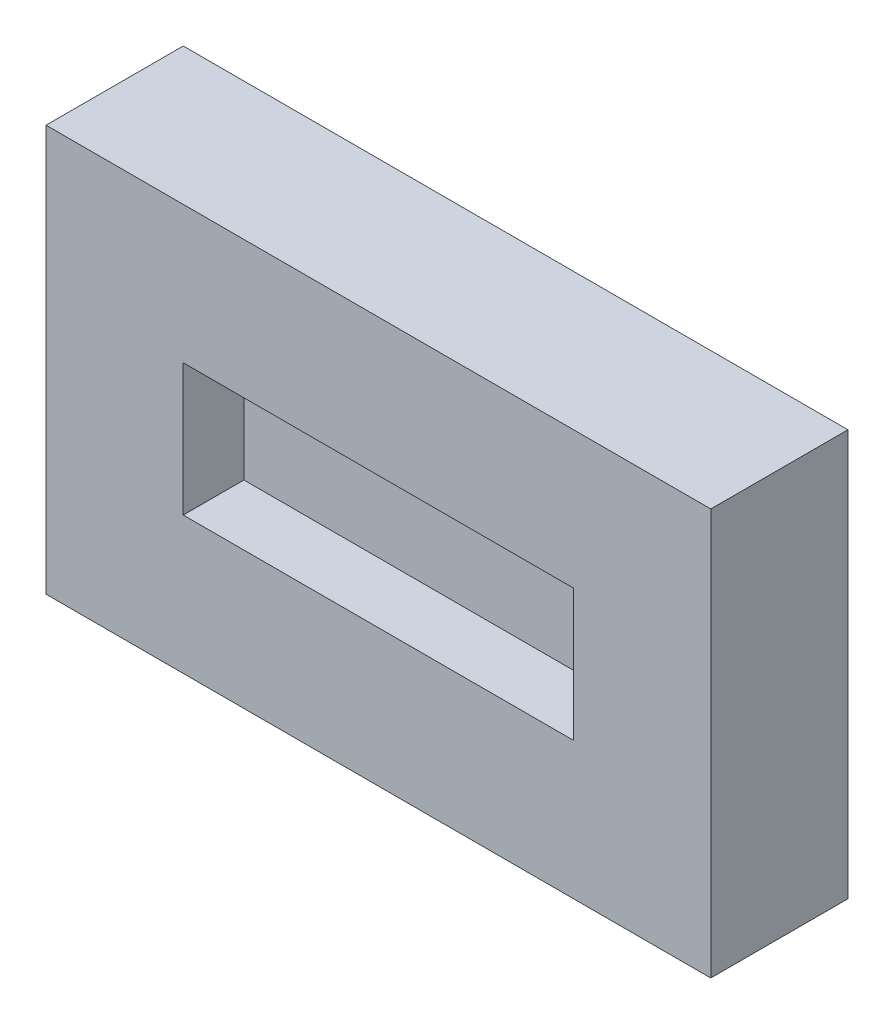
ISO-10303-21;
HEADER;
FILE_DESCRIPTION(('STEP AP214'),'2;1');
FILE_NAME('part.step','',(''),(''),'','','');
FILE_SCHEMA(('AUTOMOTIVE_DESIGN { 1 0 10303 214 1 1 1 1 }'));
ENDSEC;
DATA;
#1=APPLICATION_CONTEXT('core data for automotive mechanical design processes');
#2=APPLICATION_PROTOCOL_DEFINITION('international standard','automotive_design',2000,#1);
#3=PRODUCT_CONTEXT('',#1,'mechanical');
#4=PRODUCT('Part','Part','',(#3));
#5=PRODUCT_RELATED_PRODUCT_CATEGORY('part','',(#4));
#6=PRODUCT_DEFINITION_FORMATION('','',#4);
#7=PRODUCT_DEFINITION_CONTEXT('part definition',#1,'design');
#8=PRODUCT_DEFINITION('design','',#6,#7);
#9=PRODUCT_DEFINITION_SHAPE('','',#8);
#10=(LENGTH_UNIT() NAMED_UNIT(*) SI_UNIT(.MILLI.,.METRE.));
#11=(NAMED_UNIT(*) PLANE_ANGLE_UNIT() SI_UNIT($,.RADIAN.));
#12=(NAMED_UNIT(*) SI_UNIT($,.STERADIAN.) SOLID_ANGLE_UNIT());
#13=UNCERTAINTY_MEASURE_WITH_UNIT(LENGTH_MEASURE(1.E-05),#10,'distance_accuracy_value','');
#14=(GEOMETRIC_REPRESENTATION_CONTEXT(3) GLOBAL_UNCERTAINTY_ASSIGNED_CONTEXT((#13)) GLOBAL_UNIT_ASSIGNED_CONTEXT((#10,
#11,#12)) REPRESENTATION_CONTEXT('',''));
#15=CARTESIAN_POINT('',(0.,0.,0.));
#16=DIRECTION('',(0.,0.,1.));
#17=DIRECTION('',(1.,0.,0.));
#18=AXIS2_PLACEMENT_3D('',#15,#16,#17);
#19=CARTESIAN_POINT('',(315.,192.5,-65.));
#20=DIRECTION('',(0.,1.,0.));
#21=DIRECTION('',(-1.,0.,0.));
#22=AXIS2_PLACEMENT_3D('',#19,#20,#21);
#23=PLANE('',#22);
#24=DIRECTION('',(0.,0.,1.));
#25=VECTOR('',#24,1.);
#26=CARTESIAN_POINT('',(-315.,192.5,-65.));
#27=LINE('',#26,#25);
#28=CARTESIAN_POINT('',(-315.,192.5,-65.));
#29=VERTEX_POINT('',#28);
#30=CARTESIAN_POINT('',(-315.,192.5,65.));
#31=VERTEX_POINT('',#30);
#32=EDGE_CURVE('E64',#29,#31,#27,.T.);
#33=ORIENTED_EDGE('',*,*,#32,.T.);
#34=DIRECTION('',(-1.,0.,0.));
#35=VECTOR('',#34,1.);
#36=CARTESIAN_POINT('',(315.,192.5,65.));
#37=LINE('',#36,#35);
#38=CARTESIAN_POINT('',(315.,192.5,65.));
#39=VERTEX_POINT('',#38);
#40=EDGE_CURVE('E162',#39,#31,#37,.T.);
#41=ORIENTED_EDGE('',*,*,#40,.F.);
#42=DIRECTION('',(0.,0.,1.));
#43=VECTOR('',#42,1.);
#44=CARTESIAN_POINT('',(315.,192.5,-65.));
#45=LINE('',#44,#43);
#46=CARTESIAN_POINT('',(315.,192.5,-65.));
#47=VERTEX_POINT('',#46);
#48=EDGE_CURVE('E12',#47,#39,#45,.T.);
#49=ORIENTED_EDGE('',*,*,#48,.F.);
#50=DIRECTION('',(-1.,0.,0.));
#51=VECTOR('',#50,1.);
#52=CARTESIAN_POINT('',(315.,192.5,-65.));
#53=LINE('',#52,#51);
#54=EDGE_CURVE('E190',#47,#29,#53,.T.);
#55=ORIENTED_EDGE('',*,*,#54,.T.);
#56=EDGE_LOOP('',(#33,#41,#49,#55));
#57=FACE_BOUND('',#56,.T.);
#58=ADVANCED_FACE('F61',(#57),#23,.T.);
#59=CARTESIAN_POINT('',(315.,-192.5,-65.));
#60=DIRECTION('',(1.,0.,0.));
#61=DIRECTION('',(0.,0.,-1.));
#62=AXIS2_PLACEMENT_3D('',#59,#60,#61);
#63=PLANE('',#62);
#64=ORIENTED_EDGE('',*,*,#48,.T.);
#65=DIRECTION('',(0.,1.,0.));
#66=VECTOR('',#65,1.);
#67=CARTESIAN_POINT('',(315.,-192.5,65.));
#68=LINE('',#67,#66);
#69=CARTESIAN_POINT('',(315.,-192.5,65.));
#70=VERTEX_POINT('',#69);
#71=EDGE_CURVE('E174',#70,#39,#68,.T.);
#72=ORIENTED_EDGE('',*,*,#71,.F.);
#73=DIRECTION('',(0.,0.,1.));
#74=VECTOR('',#73,1.);
#75=CARTESIAN_POINT('',(315.,-192.5,-65.));
#76=LINE('',#75,#74);
#77=CARTESIAN_POINT('',(315.,-192.5,-65.));
#78=VERTEX_POINT('',#77);
#79=EDGE_CURVE('E70',#78,#70,#76,.T.);
#80=ORIENTED_EDGE('',*,*,#79,.F.);
#81=DIRECTION('',(0.,1.,0.));
#82=VECTOR('',#81,1.);
#83=CARTESIAN_POINT('',(315.,-192.5,-65.));
#84=LINE('',#83,#82);
#85=EDGE_CURVE('E206',#78,#47,#84,.T.);
#86=ORIENTED_EDGE('',*,*,#85,.T.);
#87=EDGE_LOOP('',(#64,#72,#80,#86));
#88=FACE_BOUND('',#87,.T.);
#89=ADVANCED_FACE('F222',(#88),#63,.T.);
#90=CARTESIAN_POINT('',(-315.,-192.5,-65.));
#91=DIRECTION('',(0.,-1.,0.));
#92=DIRECTION('',(1.,0.,0.));
#93=AXIS2_PLACEMENT_3D('',#90,#91,#92);
#94=PLANE('',#93);
#95=ORIENTED_EDGE('',*,*,#79,.T.);
#96=DIRECTION('',(1.,0.,0.));
#97=VECTOR('',#96,1.);
#98=CARTESIAN_POINT('',(-315.,-192.5,65.));
#99=LINE('',#98,#97);
#100=CARTESIAN_POINT('',(-315.,-192.5,65.));
#101=VERTEX_POINT('',#100);
#102=EDGE_CURVE('E170',#101,#70,#99,.T.);
#103=ORIENTED_EDGE('',*,*,#102,.F.);
#104=DIRECTION('',(0.,0.,1.));
#105=VECTOR('',#104,1.);
#106=CARTESIAN_POINT('',(-315.,-192.5,-65.));
#107=LINE('',#106,#105);
#108=CARTESIAN_POINT('',(-315.,-192.5,-65.));
#109=VERTEX_POINT('',#108);
#110=EDGE_CURVE('E211',#109,#101,#107,.T.);
#111=ORIENTED_EDGE('',*,*,#110,.F.);
#112=DIRECTION('',(1.,0.,0.));
#113=VECTOR('',#112,1.);
#114=CARTESIAN_POINT('',(-315.,-192.5,-65.));
#115=LINE('',#114,#113);
#116=EDGE_CURVE('E202',#109,#78,#115,.T.);
#117=ORIENTED_EDGE('',*,*,#116,.T.);
#118=EDGE_LOOP('',(#95,#103,#111,#117));
#119=FACE_BOUND('',#118,.T.);
#120=ADVANCED_FACE('F228',(#119),#94,.T.);
#121=CARTESIAN_POINT('',(-315.,192.5,-65.));
#122=DIRECTION('',(-1.,0.,0.));
#123=DIRECTION('',(0.,-1.,0.));
#124=AXIS2_PLACEMENT_3D('',#121,#122,#123);
#125=PLANE('',#124);
#126=ORIENTED_EDGE('',*,*,#110,.T.);
#127=DIRECTION('',(0.,-1.,0.));
#128=VECTOR('',#127,1.);
#129=CARTESIAN_POINT('',(-315.,192.5,65.));
#130=LINE('',#129,#128);
#131=EDGE_CURVE('E166',#31,#101,#130,.T.);
#132=ORIENTED_EDGE('',*,*,#131,.F.);
#133=ORIENTED_EDGE('',*,*,#32,.F.);
#134=DIRECTION('',(0.,-1.,0.));
#135=VECTOR('',#134,1.);
#136=CARTESIAN_POINT('',(-315.,192.5,-65.));
#137=LINE('',#136,#135);
#138=EDGE_CURVE('E198',#29,#109,#137,.T.);
#139=ORIENTED_EDGE('',*,*,#138,.T.);
#140=EDGE_LOOP('',(#126,#132,#133,#139));
#141=FACE_BOUND('',#140,.T.);
#142=ADVANCED_FACE('F217',(#141),#125,.T.);
#143=CARTESIAN_POINT('',(0.,0.,-65.));
#144=DIRECTION('',(0.,0.,1.));
#145=DIRECTION('',(1.,0.,0.));
#146=AXIS2_PLACEMENT_3D('',#143,#144,#145);
#147=PLANE('',#146);
#148=DIRECTION('',(0.,1.,0.));
#149=VECTOR('',#148,1.);
#150=CARTESIAN_POINT('',(185.,-62.4999999999999,-65.));
#151=LINE('',#150,#149);
#152=CARTESIAN_POINT('',(185.,-62.4999999999999,-65.));
#153=VERTEX_POINT('',#152);
#154=CARTESIAN_POINT('',(185.,62.5,-65.));
#155=VERTEX_POINT('',#154);
#156=EDGE_CURVE('E140',#153,#155,#151,.T.);
#157=ORIENTED_EDGE('',*,*,#156,.T.);
#158=DIRECTION('',(-1.,0.,0.));
#159=VECTOR('',#158,1.);
#160=CARTESIAN_POINT('',(185.,62.5,-65.));
#161=LINE('',#160,#159);
#162=CARTESIAN_POINT('',(-185.,62.5,-65.));
#163=VERTEX_POINT('',#162);
#164=EDGE_CURVE('E178',#155,#163,#161,.T.);
#165=ORIENTED_EDGE('',*,*,#164,.T.);
#166=DIRECTION('',(0.,-1.,0.));
#167=VECTOR('',#166,1.);
#168=CARTESIAN_POINT('',(-185.,62.5,-65.));
#169=LINE('',#168,#167);
#170=CARTESIAN_POINT('',(-185.,-62.5,-65.));
#171=VERTEX_POINT('',#170);
#172=EDGE_CURVE('E134',#163,#171,#169,.T.);
#173=ORIENTED_EDGE('',*,*,#172,.T.);
#174=DIRECTION('',(1.,0.,0.));
#175=VECTOR('',#174,1.);
#176=CARTESIAN_POINT('',(-185.,-62.5,-65.));
#177=LINE('',#176,#175);
#178=EDGE_CURVE('E78',#171,#153,#177,.T.);
#179=ORIENTED_EDGE('',*,*,#178,.T.);
#180=EDGE_LOOP('',(#157,#165,#173,#179));
#181=FACE_BOUND('',#180,.T.);
#182=ORIENTED_EDGE('',*,*,#54,.F.);
#183=ORIENTED_EDGE('',*,*,#85,.F.);
#184=ORIENTED_EDGE('',*,*,#116,.F.);
#185=ORIENTED_EDGE('',*,*,#138,.F.);
#186=EDGE_LOOP('',(#182,#183,#184,#185));
#187=FACE_BOUND('',#186,.T.);
#188=ADVANCED_FACE('F226',(#181,#187),#147,.F.);
#189=CARTESIAN_POINT('',(185.,62.5,-65.));
#190=DIRECTION('',(0.,1.,0.));
#191=DIRECTION('',(-1.,0.,0.));
#192=AXIS2_PLACEMENT_3D('',#189,#190,#191);
#193=PLANE('',#192);
#194=DIRECTION('',(0.,0.,1.));
#195=VECTOR('',#194,1.);
#196=CARTESIAN_POINT('',(185.,62.5,-65.));
#197=LINE('',#196,#195);
#198=CARTESIAN_POINT('',(185.,62.5,65.));
#199=VERTEX_POINT('',#198);
#200=EDGE_CURVE('E145',#155,#199,#197,.T.);
#201=ORIENTED_EDGE('',*,*,#200,.T.);
#202=DIRECTION('',(-1.,0.,0.));
#203=VECTOR('',#202,1.);
#204=CARTESIAN_POINT('',(185.,62.5,65.));
#205=LINE('',#204,#203);
#206=CARTESIAN_POINT('',(-185.,62.5,65.));
#207=VERTEX_POINT('',#206);
#208=EDGE_CURVE('E143',#199,#207,#205,.T.);
#209=ORIENTED_EDGE('',*,*,#208,.T.);
#210=DIRECTION('',(0.,0.,1.));
#211=VECTOR('',#210,1.);
#212=CARTESIAN_POINT('',(-185.,62.5,-65.));
#213=LINE('',#212,#211);
#214=EDGE_CURVE('E127',#163,#207,#213,.T.);
#215=ORIENTED_EDGE('',*,*,#214,.F.);
#216=ORIENTED_EDGE('',*,*,#164,.F.);
#217=EDGE_LOOP('',(#201,#209,#215,#216));
#218=FACE_BOUND('',#217,.T.);
#219=ADVANCED_FACE('F144',(#218),#193,.F.);
#220=CARTESIAN_POINT('',(185.,-62.4999999999999,-65.));
#221=DIRECTION('',(1.,0.,0.));
#222=DIRECTION('',(0.,0.,-1.));
#223=AXIS2_PLACEMENT_3D('',#220,#221,#222);
#224=PLANE('',#223);
#225=DIRECTION('',(0.,0.,1.));
#226=VECTOR('',#225,1.);
#227=CARTESIAN_POINT('',(185.,-62.4999999999999,-65.));
#228=LINE('',#227,#226);
#229=CARTESIAN_POINT('',(185.,-62.4999999999999,65.));
#230=VERTEX_POINT('',#229);
#231=EDGE_CURVE('E191',#153,#230,#228,.T.);
#232=ORIENTED_EDGE('',*,*,#231,.T.);
#233=DIRECTION('',(0.,1.,0.));
#234=VECTOR('',#233,1.);
#235=CARTESIAN_POINT('',(185.,-62.4999999999999,65.));
#236=LINE('',#235,#234);
#237=EDGE_CURVE('E157',#230,#199,#236,.T.);
#238=ORIENTED_EDGE('',*,*,#237,.T.);
#239=ORIENTED_EDGE('',*,*,#200,.F.);
#240=ORIENTED_EDGE('',*,*,#156,.F.);
#241=EDGE_LOOP('',(#232,#238,#239,#240));
#242=FACE_BOUND('',#241,.T.);
#243=ADVANCED_FACE('F271',(#242),#224,.F.);
#244=CARTESIAN_POINT('',(-185.,-62.5,-65.));
#245=DIRECTION('',(0.,-1.,0.));
#246=DIRECTION('',(1.,0.,0.));
#247=AXIS2_PLACEMENT_3D('',#244,#245,#246);
#248=PLANE('',#247);
#249=DIRECTION('',(0.,0.,1.));
#250=VECTOR('',#249,1.);
#251=CARTESIAN_POINT('',(-185.,-62.5,-65.));
#252=LINE('',#251,#250);
#253=CARTESIAN_POINT('',(-185.,-62.5,65.));
#254=VERTEX_POINT('',#253);
#255=EDGE_CURVE('E139',#171,#254,#252,.T.);
#256=ORIENTED_EDGE('',*,*,#255,.T.);
#257=DIRECTION('',(1.,0.,0.));
#258=VECTOR('',#257,1.);
#259=CARTESIAN_POINT('',(-185.,-62.5,65.));
#260=LINE('',#259,#258);
#261=EDGE_CURVE('E153',#254,#230,#260,.T.);
#262=ORIENTED_EDGE('',*,*,#261,.T.);
#263=ORIENTED_EDGE('',*,*,#231,.F.);
#264=ORIENTED_EDGE('',*,*,#178,.F.);
#265=EDGE_LOOP('',(#256,#262,#263,#264));
#266=FACE_BOUND('',#265,.T.);
#267=ADVANCED_FACE('F280',(#266),#248,.F.);
#268=CARTESIAN_POINT('',(-185.,62.5,-65.));
#269=DIRECTION('',(-1.,0.,0.));
#270=DIRECTION('',(0.,-1.,0.));
#271=AXIS2_PLACEMENT_3D('',#268,#269,#270);
#272=PLANE('',#271);
#273=ORIENTED_EDGE('',*,*,#214,.T.);
#274=DIRECTION('',(0.,-1.,0.));
#275=VECTOR('',#274,1.);
#276=CARTESIAN_POINT('',(-185.,62.5,65.));
#277=LINE('',#276,#275);
#278=EDGE_CURVE('E131',#207,#254,#277,.T.);
#279=ORIENTED_EDGE('',*,*,#278,.T.);
#280=ORIENTED_EDGE('',*,*,#255,.F.);
#281=ORIENTED_EDGE('',*,*,#172,.F.);
#282=EDGE_LOOP('',(#273,#279,#280,#281));
#283=FACE_BOUND('',#282,.T.);
#284=ADVANCED_FACE('F129',(#283),#272,.F.);
#285=CARTESIAN_POINT('',(0.,0.,65.));
#286=DIRECTION('',(0.,0.,1.));
#287=DIRECTION('',(1.,0.,0.));
#288=AXIS2_PLACEMENT_3D('',#285,#286,#287);
#289=PLANE('',#288);
#290=ORIENTED_EDGE('',*,*,#40,.T.);
#291=ORIENTED_EDGE('',*,*,#131,.T.);
#292=ORIENTED_EDGE('',*,*,#102,.T.);
#293=ORIENTED_EDGE('',*,*,#71,.T.);
#294=EDGE_LOOP('',(#290,#291,#292,#293));
#295=FACE_BOUND('',#294,.T.);
#296=ORIENTED_EDGE('',*,*,#278,.F.);
#297=ORIENTED_EDGE('',*,*,#208,.F.);
#298=ORIENTED_EDGE('',*,*,#237,.F.);
#299=ORIENTED_EDGE('',*,*,#261,.F.);
#300=EDGE_LOOP('',(#296,#297,#298,#299));
#301=FACE_BOUND('',#300,.T.);
#302=ADVANCED_FACE('F151',(#295,#301),#289,.T.);
#303=CLOSED_SHELL('',(#58,#89,#120,#142,#188,#219,#243,#267,#284,#302));
#304=MANIFOLD_SOLID_BREP('B2',#303);
#305=CARTESIAN_POINT('',(-185.,62.5,-7.5));
#306=DIRECTION('',(-1.,0.,0.));
#307=DIRECTION('',(0.,-1.,0.));
#308=AXIS2_PLACEMENT_3D('',#305,#306,#307);
#309=PLANE('',#308);
#310=DIRECTION('',(0.,0.,1.));
#311=VECTOR('',#310,1.);
#312=CARTESIAN_POINT('',(-185.,-62.5,-7.5));
#313=LINE('',#312,#311);
#314=CARTESIAN_POINT('',(-185.,-62.5,-7.5));
#315=VERTEX_POINT('',#314);
#316=CARTESIAN_POINT('',(-185.,-62.5,7.5));
#317=VERTEX_POINT('',#316);
#318=EDGE_CURVE('E358',#315,#317,#313,.T.);
#319=ORIENTED_EDGE('',*,*,#318,.T.);
#320=DIRECTION('',(0.,-1.,0.));
#321=VECTOR('',#320,1.);
#322=CARTESIAN_POINT('',(-185.,62.5,7.5));
#323=LINE('',#322,#321);
#324=CARTESIAN_POINT('',(-185.,62.5,7.5));
#325=VERTEX_POINT('',#324);
#326=EDGE_CURVE('E395',#325,#317,#323,.T.);
#327=ORIENTED_EDGE('',*,*,#326,.F.);
#328=DIRECTION('',(0.,0.,1.));
#329=VECTOR('',#328,1.);
#330=CARTESIAN_POINT('',(-185.,62.5,-7.5));
#331=LINE('',#330,#329);
#332=CARTESIAN_POINT('',(-185.,62.5,-7.5));
#333=VERTEX_POINT('',#332);
#334=EDGE_CURVE('E59',#333,#325,#331,.T.);
#335=ORIENTED_EDGE('',*,*,#334,.F.);
#336=DIRECTION('',(0.,-1.,0.));
#337=VECTOR('',#336,1.);
#338=CARTESIAN_POINT('',(-185.,62.5,-7.5));
#339=LINE('',#338,#337);
#340=EDGE_CURVE('E396',#333,#315,#339,.T.);
#341=ORIENTED_EDGE('',*,*,#340,.T.);
#342=EDGE_LOOP('',(#319,#327,#335,#341));
#343=FACE_BOUND('',#342,.T.);
#344=ADVANCED_FACE('F355',(#343),#309,.T.);
#345=CARTESIAN_POINT('',(185.,62.5,-7.5));
#346=DIRECTION('',(0.,1.,0.));
#347=DIRECTION('',(-1.,0.,0.));
#348=AXIS2_PLACEMENT_3D('',#345,#346,#347);
#349=PLANE('',#348);
#350=ORIENTED_EDGE('',*,*,#334,.T.);
#351=DIRECTION('',(-1.,0.,0.));
#352=VECTOR('',#351,1.);
#353=CARTESIAN_POINT('',(185.,62.5,7.5));
#354=LINE('',#353,#352);
#355=CARTESIAN_POINT('',(185.,62.5,7.5));
#356=VERTEX_POINT('',#355);
#357=EDGE_CURVE('E412',#356,#325,#354,.T.);
#358=ORIENTED_EDGE('',*,*,#357,.F.);
#359=DIRECTION('',(0.,0.,1.));
#360=VECTOR('',#359,1.);
#361=CARTESIAN_POINT('',(185.,62.5,-7.5));
#362=LINE('',#361,#360);
#363=CARTESIAN_POINT('',(185.,62.5,-7.5));
#364=VERTEX_POINT('',#363);
#365=EDGE_CURVE('E363',#364,#356,#362,.T.);
#366=ORIENTED_EDGE('',*,*,#365,.F.);
#367=DIRECTION('',(-1.,0.,0.));
#368=VECTOR('',#367,1.);
#369=CARTESIAN_POINT('',(185.,62.5,-7.5));
#370=LINE('',#369,#368);
#371=EDGE_CURVE('E401',#364,#333,#370,.T.);
#372=ORIENTED_EDGE('',*,*,#371,.T.);
#373=EDGE_LOOP('',(#350,#358,#366,#372));
#374=FACE_BOUND('',#373,.T.);
#375=ADVANCED_FACE('F427',(#374),#349,.T.);
#376=CARTESIAN_POINT('',(185.,62.5,-7.5));
#377=DIRECTION('',(1.,0.,0.));
#378=DIRECTION('',(0.,0.,-1.));
#379=AXIS2_PLACEMENT_3D('',#376,#377,#378);
#380=PLANE('',#379);
#381=ORIENTED_EDGE('',*,*,#365,.T.);
#382=DIRECTION('',(0.,1.,0.));
#383=VECTOR('',#382,1.);
#384=CARTESIAN_POINT('',(185.,62.5,7.5));
#385=LINE('',#384,#383);
#386=CARTESIAN_POINT('',(185.,-62.4999999999999,7.5));
#387=VERTEX_POINT('',#386);
#388=EDGE_CURVE('E408',#387,#356,#385,.T.);
#389=ORIENTED_EDGE('',*,*,#388,.F.);
#390=DIRECTION('',(0.,0.,1.));
#391=VECTOR('',#390,1.);
#392=CARTESIAN_POINT('',(185.,-62.4999999999999,-7.5));
#393=LINE('',#392,#391);
#394=CARTESIAN_POINT('',(185.,-62.4999999999999,-7.5));
#395=VERTEX_POINT('',#394);
#396=EDGE_CURVE('E400',#395,#387,#393,.T.);
#397=ORIENTED_EDGE('',*,*,#396,.F.);
#398=DIRECTION('',(0.,1.,0.));
#399=VECTOR('',#398,1.);
#400=CARTESIAN_POINT('',(185.,62.5,-7.5));
#401=LINE('',#400,#399);
#402=EDGE_CURVE('E420',#395,#364,#401,.T.);
#403=ORIENTED_EDGE('',*,*,#402,.T.);
#404=EDGE_LOOP('',(#381,#389,#397,#403));
#405=FACE_BOUND('',#404,.T.);
#406=ADVANCED_FACE('F424',(#405),#380,.T.);
#407=CARTESIAN_POINT('',(185.,-62.4999999999999,-7.5));
#408=DIRECTION('',(0.,-1.,0.));
#409=DIRECTION('',(1.,0.,0.));
#410=AXIS2_PLACEMENT_3D('',#407,#408,#409);
#411=PLANE('',#410);
#412=ORIENTED_EDGE('',*,*,#396,.T.);
#413=DIRECTION('',(1.,0.,0.));
#414=VECTOR('',#413,1.);
#415=CARTESIAN_POINT('',(185.,-62.4999999999999,7.5));
#416=LINE('',#415,#414);
#417=EDGE_CURVE('E403',#317,#387,#416,.T.);
#418=ORIENTED_EDGE('',*,*,#417,.F.);
#419=ORIENTED_EDGE('',*,*,#318,.F.);
#420=DIRECTION('',(1.,0.,0.));
#421=VECTOR('',#420,1.);
#422=CARTESIAN_POINT('',(185.,-62.4999999999999,-7.5));
#423=LINE('',#422,#421);
#424=EDGE_CURVE('E418',#315,#395,#423,.T.);
#425=ORIENTED_EDGE('',*,*,#424,.T.);
#426=EDGE_LOOP('',(#412,#418,#419,#425));
#427=FACE_BOUND('',#426,.T.);
#428=ADVANCED_FACE('F404',(#427),#411,.T.);
#429=CARTESIAN_POINT('',(0.,0.,-7.5));
#430=DIRECTION('',(0.,0.,-1.));
#431=DIRECTION('',(-1.,0.,0.));
#432=AXIS2_PLACEMENT_3D('',#429,#430,#431);
#433=PLANE('',#432);
#434=ORIENTED_EDGE('',*,*,#340,.F.);
#435=ORIENTED_EDGE('',*,*,#371,.F.);
#436=ORIENTED_EDGE('',*,*,#402,.F.);
#437=ORIENTED_EDGE('',*,*,#424,.F.);
#438=EDGE_LOOP('',(#434,#435,#436,#437));
#439=FACE_BOUND('',#438,.T.);
#440=ADVANCED_FACE('F429',(#439),#433,.T.);
#441=CARTESIAN_POINT('',(0.,0.,7.5));
#442=DIRECTION('',(0.,0.,-1.));
#443=DIRECTION('',(-1.,0.,0.));
#444=AXIS2_PLACEMENT_3D('',#441,#442,#443);
#445=PLANE('',#444);
#446=ORIENTED_EDGE('',*,*,#326,.T.);
#447=ORIENTED_EDGE('',*,*,#417,.T.);
#448=ORIENTED_EDGE('',*,*,#388,.T.);
#449=ORIENTED_EDGE('',*,*,#357,.T.);
#450=EDGE_LOOP('',(#446,#447,#448,#449));
#451=FACE_BOUND('',#450,.T.);
#452=ADVANCED_FACE('F411',(#451),#445,.F.);
#453=CLOSED_SHELL('',(#344,#375,#406,#428,#440,#452));
#454=MANIFOLD_SOLID_BREP('B6',#453);
#455=ADVANCED_BREP_SHAPE_REPRESENTATION('',(#18,#304,#454),#14);
#456=SHAPE_DEFINITION_REPRESENTATION(#9,#455);
ENDSEC;
END-ISO-10303-21;
